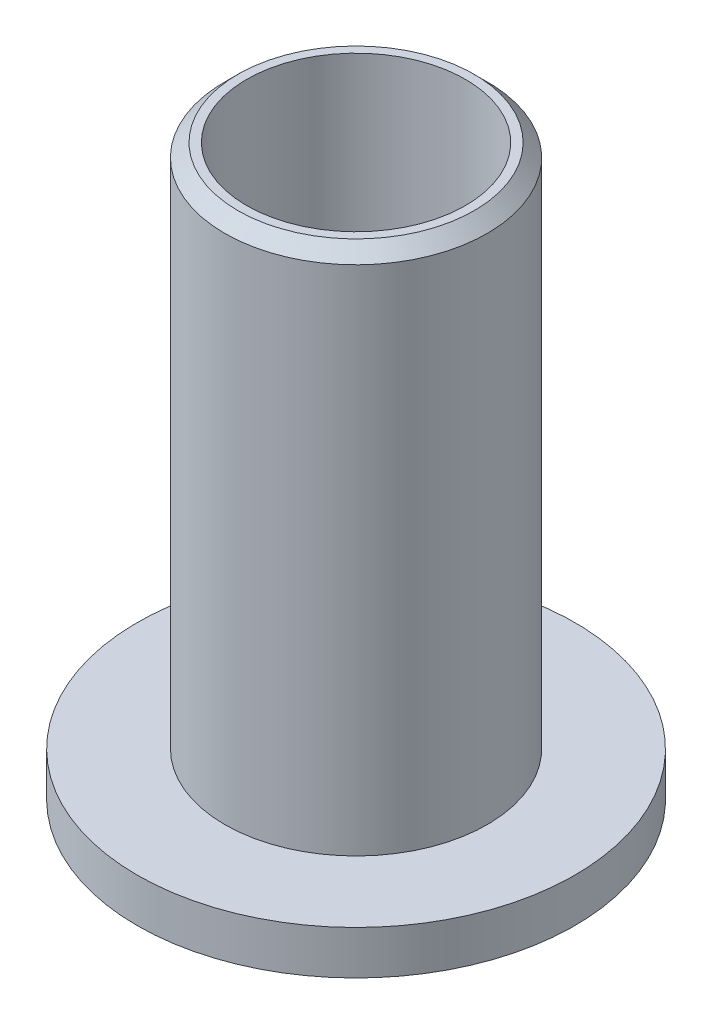
ISO-10303-21;
HEADER;
FILE_DESCRIPTION(('STEP AP214'),'2;1');
FILE_NAME('part.step','',(''),(''),'','','');
FILE_SCHEMA(('AUTOMOTIVE_DESIGN { 1 0 10303 214 1 1 1 1 }'));
ENDSEC;
DATA;
#1=APPLICATION_CONTEXT('core data for automotive mechanical design processes');
#2=APPLICATION_PROTOCOL_DEFINITION('international standard','automotive_design',2000,#1);
#3=PRODUCT_CONTEXT('',#1,'mechanical');
#4=PRODUCT('Part','Part','',(#3));
#5=PRODUCT_RELATED_PRODUCT_CATEGORY('part','',(#4));
#6=PRODUCT_DEFINITION_FORMATION('','',#4);
#7=PRODUCT_DEFINITION_CONTEXT('part definition',#1,'design');
#8=PRODUCT_DEFINITION('design','',#6,#7);
#9=PRODUCT_DEFINITION_SHAPE('','',#8);
#10=(LENGTH_UNIT() NAMED_UNIT(*) SI_UNIT(.MILLI.,.METRE.));
#11=(NAMED_UNIT(*) PLANE_ANGLE_UNIT() SI_UNIT($,.RADIAN.));
#12=(NAMED_UNIT(*) SI_UNIT($,.STERADIAN.) SOLID_ANGLE_UNIT());
#13=UNCERTAINTY_MEASURE_WITH_UNIT(LENGTH_MEASURE(1.E-05),#10,'distance_accuracy_value','');
#14=(GEOMETRIC_REPRESENTATION_CONTEXT(3) GLOBAL_UNCERTAINTY_ASSIGNED_CONTEXT((#13)) GLOBAL_UNIT_ASSIGNED_CONTEXT((#10,
#11,#12)) REPRESENTATION_CONTEXT('',''));
#15=CARTESIAN_POINT('',(0.,0.,0.));
#16=DIRECTION('',(0.,0.,1.));
#17=DIRECTION('',(1.,0.,0.));
#18=AXIS2_PLACEMENT_3D('',#15,#16,#17);
#19=CARTESIAN_POINT('',(0.,1.,0.));
#20=DIRECTION('',(0.,-1.,0.));
#21=DIRECTION('',(0.,0.,-1.));
#22=AXIS2_PLACEMENT_3D('',#19,#20,#21);
#23=CYLINDRICAL_SURFACE('',#22,5.);
#24=CARTESIAN_POINT('',(0.,1.,0.));
#25=DIRECTION('',(0.,1.,0.));
#26=DIRECTION('',(0.,0.,1.));
#27=AXIS2_PLACEMENT_3D('',#24,#25,#26);
#28=CIRCLE('',#27,5.);
#29=CARTESIAN_POINT('',(0.,1.,5.));
#30=VERTEX_POINT('',#29);
#31=EDGE_CURVE('E61',#30,#30,#28,.T.);
#32=ORIENTED_EDGE('',*,*,#31,.F.);
#33=EDGE_LOOP('',(#32));
#34=FACE_BOUND('',#33,.T.);
#35=CARTESIAN_POINT('',(0.,0.,0.));
#36=DIRECTION('',(0.,1.,0.));
#37=DIRECTION('',(0.,0.,1.));
#38=AXIS2_PLACEMENT_3D('',#35,#36,#37);
#39=CIRCLE('',#38,5.);
#40=CARTESIAN_POINT('',(0.,0.,5.));
#41=VERTEX_POINT('',#40);
#42=EDGE_CURVE('E57',#41,#41,#39,.T.);
#43=ORIENTED_EDGE('',*,*,#42,.T.);
#44=EDGE_LOOP('',(#43));
#45=FACE_BOUND('',#44,.T.);
#46=ADVANCED_FACE('F39',(#34,#45),#23,.T.);
#47=CARTESIAN_POINT('',(0.,1.,0.));
#48=DIRECTION('',(0.,1.,0.));
#49=DIRECTION('',(0.,0.,1.));
#50=AXIS2_PLACEMENT_3D('',#47,#48,#49);
#51=PLANE('',#50);
#52=CARTESIAN_POINT('',(0.,1.,0.));
#53=DIRECTION('',(0.,1.,0.));
#54=DIRECTION('',(0.,0.,1.));
#55=AXIS2_PLACEMENT_3D('',#52,#53,#54);
#56=CIRCLE('',#55,3.);
#57=CARTESIAN_POINT('',(0.,1.,3.));
#58=VERTEX_POINT('',#57);
#59=EDGE_CURVE('E54',#58,#58,#56,.T.);
#60=ORIENTED_EDGE('',*,*,#59,.F.);
#61=EDGE_LOOP('',(#60));
#62=FACE_BOUND('',#61,.T.);
#63=ORIENTED_EDGE('',*,*,#31,.T.);
#64=EDGE_LOOP('',(#63));
#65=FACE_BOUND('',#64,.T.);
#66=ADVANCED_FACE('F94',(#62,#65),#51,.T.);
#67=CARTESIAN_POINT('',(0.,0.,0.));
#68=DIRECTION('',(0.,1.,0.));
#69=DIRECTION('',(0.,0.,1.));
#70=AXIS2_PLACEMENT_3D('',#67,#68,#69);
#71=PLANE('',#70);
#72=CARTESIAN_POINT('',(0.,0.,0.));
#73=DIRECTION('',(0.,1.,0.));
#74=DIRECTION('',(0.,0.,1.));
#75=AXIS2_PLACEMENT_3D('',#72,#73,#74);
#76=CIRCLE('',#75,2.5);
#77=CARTESIAN_POINT('',(0.,0.,2.5));
#78=VERTEX_POINT('',#77);
#79=EDGE_CURVE('E68',#78,#78,#76,.T.);
#80=ORIENTED_EDGE('',*,*,#79,.T.);
#81=EDGE_LOOP('',(#80));
#82=FACE_BOUND('',#81,.T.);
#83=ORIENTED_EDGE('',*,*,#42,.F.);
#84=EDGE_LOOP('',(#83));
#85=FACE_BOUND('',#84,.T.);
#86=ADVANCED_FACE('F99',(#82,#85),#71,.F.);
#87=CARTESIAN_POINT('',(0.,13.,0.));
#88=DIRECTION('',(0.,-1.,0.));
#89=DIRECTION('',(0.,0.,-1.));
#90=AXIS2_PLACEMENT_3D('',#87,#88,#89);
#91=CYLINDRICAL_SURFACE('',#90,3.);
#92=CARTESIAN_POINT('',(0.,12.7,0.));
#93=DIRECTION('',(0.,1.,0.));
#94=DIRECTION('',(0.,0.,1.));
#95=AXIS2_PLACEMENT_3D('',#92,#93,#94);
#96=CIRCLE('',#95,3.);
#97=CARTESIAN_POINT('',(0.,12.7,3.));
#98=VERTEX_POINT('',#97);
#99=EDGE_CURVE('E10',#98,#98,#96,.F.);
#100=ORIENTED_EDGE('',*,*,#99,.T.);
#101=EDGE_LOOP('',(#100));
#102=FACE_BOUND('',#101,.T.);
#103=ORIENTED_EDGE('',*,*,#59,.T.);
#104=EDGE_LOOP('',(#103));
#105=FACE_BOUND('',#104,.T.);
#106=ADVANCED_FACE('F83',(#102,#105),#91,.T.);
#107=CARTESIAN_POINT('',(0.,13.,0.));
#108=DIRECTION('',(0.,1.,0.));
#109=DIRECTION('',(0.,0.,1.));
#110=AXIS2_PLACEMENT_3D('',#107,#108,#109);
#111=PLANE('',#110);
#112=CARTESIAN_POINT('',(0.,13.,0.));
#113=DIRECTION('',(0.,1.,0.));
#114=DIRECTION('',(0.,0.,1.));
#115=AXIS2_PLACEMENT_3D('',#112,#113,#114);
#116=CIRCLE('',#115,2.5);
#117=CARTESIAN_POINT('',(0.,13.,2.5));
#118=VERTEX_POINT('',#117);
#119=EDGE_CURVE('E44',#118,#118,#116,.T.);
#120=ORIENTED_EDGE('',*,*,#119,.F.);
#121=EDGE_LOOP('',(#120));
#122=FACE_BOUND('',#121,.T.);
#123=CARTESIAN_POINT('',(0.,13.,0.));
#124=DIRECTION('',(0.,1.,0.));
#125=DIRECTION('',(0.,0.,1.));
#126=AXIS2_PLACEMENT_3D('',#123,#124,#125);
#127=CIRCLE('',#126,2.7);
#128=CARTESIAN_POINT('',(0.,13.,2.7));
#129=VERTEX_POINT('',#128);
#130=EDGE_CURVE('E49',#129,#129,#127,.T.);
#131=ORIENTED_EDGE('',*,*,#130,.T.);
#132=EDGE_LOOP('',(#131));
#133=FACE_BOUND('',#132,.T.);
#134=ADVANCED_FACE('F80',(#122,#133),#111,.T.);
#135=CARTESIAN_POINT('',(0.,13.,0.));
#136=DIRECTION('',(0.,-1.,0.));
#137=DIRECTION('',(0.,0.,-1.));
#138=AXIS2_PLACEMENT_3D('',#135,#136,#137);
#139=CONICAL_SURFACE('',#138,2.7,0.785398163397448);
#140=ORIENTED_EDGE('',*,*,#99,.F.);
#141=EDGE_LOOP('',(#140));
#142=FACE_BOUND('',#141,.T.);
#143=ORIENTED_EDGE('',*,*,#130,.F.);
#144=EDGE_LOOP('',(#143));
#145=FACE_BOUND('',#144,.T.);
#146=ADVANCED_FACE('F42',(#142,#145),#139,.T.);
#147=CARTESIAN_POINT('',(0.,0.,0.));
#148=DIRECTION('',(0.,1.,0.));
#149=DIRECTION('',(0.,0.,1.));
#150=AXIS2_PLACEMENT_3D('',#147,#148,#149);
#151=CYLINDRICAL_SURFACE('',#150,2.5);
#152=ORIENTED_EDGE('',*,*,#119,.T.);
#153=EDGE_LOOP('',(#152));
#154=FACE_BOUND('',#153,.T.);
#155=ORIENTED_EDGE('',*,*,#79,.F.);
#156=EDGE_LOOP('',(#155));
#157=FACE_BOUND('',#156,.T.);
#158=ADVANCED_FACE('F77',(#154,#157),#151,.F.);
#159=CLOSED_SHELL('',(#46,#66,#86,#106,#134,#146,#158));
#160=MANIFOLD_SOLID_BREP('B2',#159);
#161=ADVANCED_BREP_SHAPE_REPRESENTATION('',(#18,#160),#14);
#162=SHAPE_DEFINITION_REPRESENTATION(#9,#161);
ENDSEC;
END-ISO-10303-21;
